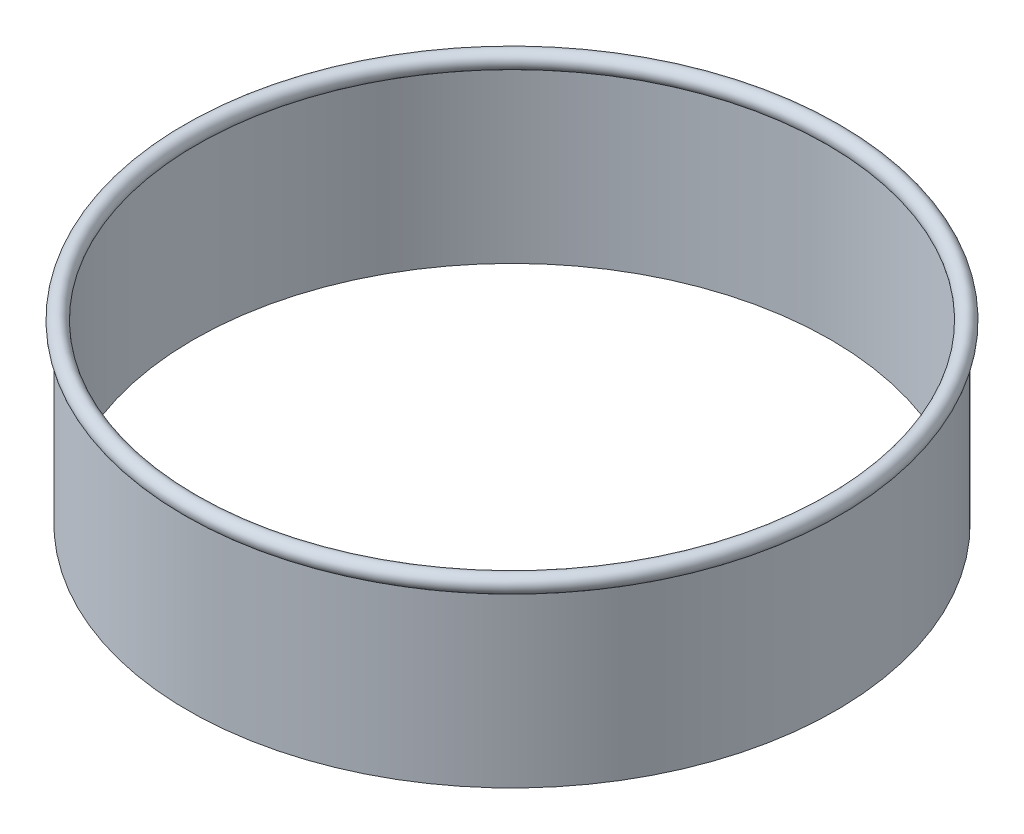
ISO-10303-21;
HEADER;
FILE_DESCRIPTION(('STEP AP214'),'2;1');
FILE_NAME('part.step','',(''),(''),'','','');
FILE_SCHEMA(('AUTOMOTIVE_DESIGN { 1 0 10303 214 1 1 1 1 }'));
ENDSEC;
DATA;
#1=APPLICATION_CONTEXT('core data for automotive mechanical design processes');
#2=APPLICATION_PROTOCOL_DEFINITION('international standard','automotive_design',2000,#1);
#3=PRODUCT_CONTEXT('',#1,'mechanical');
#4=PRODUCT('Part','Part','',(#3));
#5=PRODUCT_RELATED_PRODUCT_CATEGORY('part','',(#4));
#6=PRODUCT_DEFINITION_FORMATION('','',#4);
#7=PRODUCT_DEFINITION_CONTEXT('part definition',#1,'design');
#8=PRODUCT_DEFINITION('design','',#6,#7);
#9=PRODUCT_DEFINITION_SHAPE('','',#8);
#10=(LENGTH_UNIT() NAMED_UNIT(*) SI_UNIT(.MILLI.,.METRE.));
#11=(NAMED_UNIT(*) PLANE_ANGLE_UNIT() SI_UNIT($,.RADIAN.));
#12=(NAMED_UNIT(*) SI_UNIT($,.STERADIAN.) SOLID_ANGLE_UNIT());
#13=UNCERTAINTY_MEASURE_WITH_UNIT(LENGTH_MEASURE(1.E-05),#10,'distance_accuracy_value','');
#14=(GEOMETRIC_REPRESENTATION_CONTEXT(3) GLOBAL_UNCERTAINTY_ASSIGNED_CONTEXT((#13)) GLOBAL_UNIT_ASSIGNED_CONTEXT((#10,
#11,#12)) REPRESENTATION_CONTEXT('',''));
#15=CARTESIAN_POINT('',(0.,0.,0.));
#16=DIRECTION('',(0.,0.,1.));
#17=DIRECTION('',(1.,0.,0.));
#18=AXIS2_PLACEMENT_3D('',#15,#16,#17);
#19=CARTESIAN_POINT('',(109.5375,1775.1933,0.));
#20=DIRECTION('',(0.,1.,0.));
#21=DIRECTION('',(0.,0.,1.));
#22=AXIS2_PLACEMENT_3D('',#19,#20,#21);
#23=PLANE('',#22);
#24=CARTESIAN_POINT('',(0.,1775.1933,0.));
#25=DIRECTION('',(0.,-1.,0.));
#26=DIRECTION('',(0.,0.,-1.));
#27=AXIS2_PLACEMENT_3D('',#24,#25,#26);
#28=CIRCLE('',#27,107.7087);
#29=CARTESIAN_POINT('',(0.,1775.1933,-107.7087));
#30=VERTEX_POINT('',#29);
#31=EDGE_CURVE('E11',#30,#30,#28,.T.);
#32=ORIENTED_EDGE('',*,*,#31,.T.);
#33=EDGE_LOOP('',(#32));
#34=FACE_BOUND('',#33,.T.);
#35=CARTESIAN_POINT('',(0.,1775.1933,0.));
#36=DIRECTION('',(0.,-1.,0.));
#37=DIRECTION('',(0.,0.,-1.));
#38=AXIS2_PLACEMENT_3D('',#35,#36,#37);
#39=CIRCLE('',#38,109.5375);
#40=CARTESIAN_POINT('',(0.,1775.1933,-109.5375));
#41=VERTEX_POINT('',#40);
#42=EDGE_CURVE('E64',#41,#41,#39,.T.);
#43=ORIENTED_EDGE('',*,*,#42,.F.);
#44=EDGE_LOOP('',(#43));
#45=FACE_BOUND('',#44,.T.);
#46=ADVANCED_FACE('F47',(#34,#45),#23,.T.);
#47=CARTESIAN_POINT('',(0.,0.,0.));
#48=DIRECTION('',(0.,-1.,0.));
#49=DIRECTION('',(0.,0.,-1.));
#50=AXIS2_PLACEMENT_3D('',#47,#48,#49);
#51=CYLINDRICAL_SURFACE('',#50,107.7087);
#52=CARTESIAN_POINT('',(0.,1718.437,0.));
#53=DIRECTION('',(0.,-1.,0.));
#54=DIRECTION('',(0.,0.,-1.));
#55=AXIS2_PLACEMENT_3D('',#52,#53,#54);
#56=CIRCLE('',#55,107.7087);
#57=CARTESIAN_POINT('',(0.,1718.437,-107.7087));
#58=VERTEX_POINT('',#57);
#59=EDGE_CURVE('E54',#58,#58,#56,.T.);
#60=ORIENTED_EDGE('',*,*,#59,.T.);
#61=EDGE_LOOP('',(#60));
#62=FACE_BOUND('',#61,.T.);
#63=ORIENTED_EDGE('',*,*,#31,.F.);
#64=EDGE_LOOP('',(#63));
#65=FACE_BOUND('',#64,.T.);
#66=ADVANCED_FACE('F75',(#62,#65),#51,.F.);
#67=CARTESIAN_POINT('',(107.7087,1718.437,0.));
#68=DIRECTION('',(0.,-1.,0.));
#69=DIRECTION('',(0.,0.,-1.));
#70=AXIS2_PLACEMENT_3D('',#67,#68,#69);
#71=PLANE('',#70);
#72=CARTESIAN_POINT('',(0.,1718.437,0.));
#73=DIRECTION('',(0.,-1.,0.));
#74=DIRECTION('',(0.,0.,-1.));
#75=AXIS2_PLACEMENT_3D('',#72,#73,#74);
#76=CIRCLE('',#75,109.5375);
#77=CARTESIAN_POINT('',(0.,1718.437,-109.5375));
#78=VERTEX_POINT('',#77);
#79=EDGE_CURVE('E59',#78,#78,#76,.T.);
#80=ORIENTED_EDGE('',*,*,#79,.T.);
#81=EDGE_LOOP('',(#80));
#82=FACE_BOUND('',#81,.T.);
#83=ORIENTED_EDGE('',*,*,#59,.F.);
#84=EDGE_LOOP('',(#83));
#85=FACE_BOUND('',#84,.T.);
#86=ADVANCED_FACE('F79',(#82,#85),#71,.T.);
#87=CARTESIAN_POINT('',(0.,0.,0.));
#88=DIRECTION('',(0.,-1.,0.));
#89=DIRECTION('',(0.,0.,-1.));
#90=AXIS2_PLACEMENT_3D('',#87,#88,#89);
#91=CYLINDRICAL_SURFACE('',#90,109.5375);
#92=ORIENTED_EDGE('',*,*,#42,.T.);
#93=EDGE_LOOP('',(#92));
#94=FACE_BOUND('',#93,.T.);
#95=ORIENTED_EDGE('',*,*,#79,.F.);
#96=EDGE_LOOP('',(#95));
#97=FACE_BOUND('',#96,.T.);
#98=ADVANCED_FACE('F71',(#94,#97),#91,.T.);
#99=CLOSED_SHELL('',(#46,#66,#86,#98));
#100=MANIFOLD_SOLID_BREP('B2',#99);
#101=CARTESIAN_POINT('',(0.,1778.,0.));
#102=DIRECTION('',(0.,-1.,0.));
#103=DIRECTION('',(0.,0.,-1.));
#104=AXIS2_PLACEMENT_3D('',#101,#102,#103);
#105=TOROIDAL_SURFACE('',#104,108.6231,2.80669999999989);
#106=CARTESIAN_POINT('',(0.,1778.,-111.4298));
#107=VERTEX_POINT('',#106);
#108=VERTEX_LOOP('',#107);
#109=FACE_BOUND('',#108,.T.);
#110=ADVANCED_FACE('F113',(#109),#105,.T.);
#111=CLOSED_SHELL('',(#110));
#112=MANIFOLD_SOLID_BREP('B6',#111);
#113=ADVANCED_BREP_SHAPE_REPRESENTATION('',(#18,#100,#112),#14);
#114=SHAPE_DEFINITION_REPRESENTATION(#9,#113);
ENDSEC;
END-ISO-10303-21;
